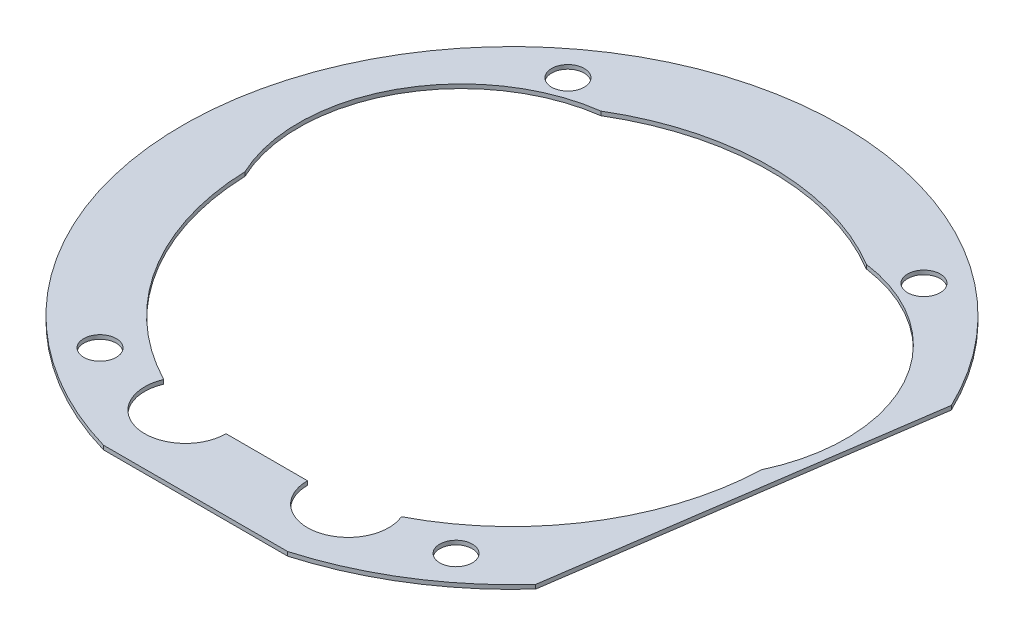
ISO-10303-21;
HEADER;
FILE_DESCRIPTION(('STEP AP214'),'2;1');
FILE_NAME('part.step','',(''),(''),'','','');
FILE_SCHEMA(('AUTOMOTIVE_DESIGN { 1 0 10303 214 1 1 1 1 }'));
ENDSEC;
DATA;
#1=APPLICATION_CONTEXT('core data for automotive mechanical design processes');
#2=APPLICATION_PROTOCOL_DEFINITION('international standard','automotive_design',2000,#1);
#3=PRODUCT_CONTEXT('',#1,'mechanical');
#4=PRODUCT('Part','Part','',(#3));
#5=PRODUCT_RELATED_PRODUCT_CATEGORY('part','',(#4));
#6=PRODUCT_DEFINITION_FORMATION('','',#4);
#7=PRODUCT_DEFINITION_CONTEXT('part definition',#1,'design');
#8=PRODUCT_DEFINITION('design','',#6,#7);
#9=PRODUCT_DEFINITION_SHAPE('','',#8);
#10=(LENGTH_UNIT() NAMED_UNIT(*) SI_UNIT(.MILLI.,.METRE.));
#11=(NAMED_UNIT(*) PLANE_ANGLE_UNIT() SI_UNIT($,.RADIAN.));
#12=(NAMED_UNIT(*) SI_UNIT($,.STERADIAN.) SOLID_ANGLE_UNIT());
#13=UNCERTAINTY_MEASURE_WITH_UNIT(LENGTH_MEASURE(1.E-05),#10,'distance_accuracy_value','');
#14=(GEOMETRIC_REPRESENTATION_CONTEXT(3) GLOBAL_UNCERTAINTY_ASSIGNED_CONTEXT((#13)) GLOBAL_UNIT_ASSIGNED_CONTEXT((#10,
#11,#12)) REPRESENTATION_CONTEXT('',''));
#15=CARTESIAN_POINT('',(0.,0.,0.));
#16=DIRECTION('',(0.,0.,1.));
#17=DIRECTION('',(1.,0.,0.));
#18=AXIS2_PLACEMENT_3D('',#15,#16,#17);
#19=CARTESIAN_POINT('',(0.,0.4,0.));
#20=DIRECTION('',(0.,1.,0.));
#21=DIRECTION('',(0.,0.,1.));
#22=AXIS2_PLACEMENT_3D('',#19,#20,#21);
#23=PLANE('',#22);
#24=CARTESIAN_POINT('',(17.5,0.4,23.));
#25=DIRECTION('',(0.,1.,0.));
#26=DIRECTION('',(0.,0.,1.));
#27=AXIS2_PLACEMENT_3D('',#24,#25,#26);
#28=CIRCLE('',#27,1.6);
#29=CARTESIAN_POINT('',(17.5,0.4,24.6));
#30=VERTEX_POINT('',#29);
#31=EDGE_CURVE('E320',#30,#30,#28,.T.);
#32=ORIENTED_EDGE('',*,*,#31,.F.);
#33=EDGE_LOOP('',(#32));
#34=FACE_BOUND('',#33,.T.);
#35=CARTESIAN_POINT('',(-17.5,0.4,-23.));
#36=DIRECTION('',(0.,1.,0.));
#37=DIRECTION('',(0.,0.,1.));
#38=AXIS2_PLACEMENT_3D('',#35,#36,#37);
#39=CIRCLE('',#38,1.6);
#40=CARTESIAN_POINT('',(-17.5,0.4,-21.4));
#41=VERTEX_POINT('',#40);
#42=EDGE_CURVE('E166',#41,#41,#39,.T.);
#43=ORIENTED_EDGE('',*,*,#42,.F.);
#44=EDGE_LOOP('',(#43));
#45=FACE_BOUND('',#44,.T.);
#46=CARTESIAN_POINT('',(0.,0.4,0.));
#47=DIRECTION('',(0.,1.,0.));
#48=DIRECTION('',(0.,0.,1.));
#49=AXIS2_PLACEMENT_3D('',#46,#47,#48);
#50=CIRCLE('',#49,32.4);
#51=CARTESIAN_POINT('',(29.2378436045863,0.4,-13.9609634822869));
#52=VERTEX_POINT('',#51);
#53=CARTESIAN_POINT('',(-9.06081428788635,0.4,31.1072603171741));
#54=VERTEX_POINT('',#53);
#55=EDGE_CURVE('E196',#52,#54,#50,.T.);
#56=ORIENTED_EDGE('',*,*,#55,.T.);
#57=DIRECTION('',(1.,0.,0.));
#58=VECTOR('',#57,1.);
#59=CARTESIAN_POINT('',(-9.06081428788635,0.4,31.1072603171741));
#60=LINE('',#59,#58);
#61=CARTESIAN_POINT('',(9.06081428788635,0.4,31.1072603171741));
#62=VERTEX_POINT('',#61);
#63=EDGE_CURVE('E199',#54,#62,#60,.T.);
#64=ORIENTED_EDGE('',*,*,#63,.T.);
#65=CARTESIAN_POINT('',(0.,0.4,0.));
#66=DIRECTION('',(0.,1.,0.));
#67=DIRECTION('',(0.,0.,1.));
#68=AXIS2_PLACEMENT_3D('',#65,#66,#67);
#69=CIRCLE('',#68,32.4);
#70=CARTESIAN_POINT('',(24.0490796532106,0.4,21.711788683421));
#71=VERTEX_POINT('',#70);
#72=EDGE_CURVE('E202',#62,#71,#69,.T.);
#73=ORIENTED_EDGE('',*,*,#72,.T.);
#74=DIRECTION('',(0.143939845714111,0.,-0.989586439284511));
#75=VECTOR('',#74,1.);
#76=CARTESIAN_POINT('',(29.2378436045863,0.4,-13.9609634822869));
#77=LINE('',#76,#75);
#78=EDGE_CURVE('E204',#71,#52,#77,.T.);
#79=ORIENTED_EDGE('',*,*,#78,.T.);
#80=EDGE_LOOP('',(#56,#64,#73,#79));
#81=FACE_BOUND('',#80,.T.);
#82=DIRECTION('',(1.,0.,0.));
#83=VECTOR('',#82,1.);
#84=CARTESIAN_POINT('',(-3.99999999999967,0.4,24.1072603171741));
#85=LINE('',#84,#83);
#86=CARTESIAN_POINT('',(-3.99999999999967,0.4,24.1072603171741));
#87=VERTEX_POINT('',#86);
#88=CARTESIAN_POINT('',(4.00000000000031,0.4,24.1072603171741));
#89=VERTEX_POINT('',#88);
#90=EDGE_CURVE('E136',#87,#89,#85,.T.);
#91=ORIENTED_EDGE('',*,*,#90,.F.);
#92=CARTESIAN_POINT('',(-7.99999999999963,0.4,24.1072603171741));
#93=DIRECTION('',(0.,1.,0.));
#94=DIRECTION('',(0.,0.,-1.));
#95=AXIS2_PLACEMENT_3D('',#92,#93,#94);
#96=CIRCLE('',#95,3.99999999999998);
#97=CARTESIAN_POINT('',(-11.6854315282744,0.4,22.5523987637238));
#98=VERTEX_POINT('',#97);
#99=EDGE_CURVE('E128',#98,#87,#96,.T.);
#100=ORIENTED_EDGE('',*,*,#99,.F.);
#101=CARTESIAN_POINT('',(0.,0.4,0.));
#102=DIRECTION('',(0.,1.,0.));
#103=DIRECTION('',(0.,0.,1.));
#104=AXIS2_PLACEMENT_3D('',#101,#102,#103);
#105=CIRCLE('',#104,25.4);
#106=CARTESIAN_POINT('',(-25.3853852768264,0.4,0.861518628404147));
#107=VERTEX_POINT('',#106);
#108=EDGE_CURVE('E163',#107,#98,#105,.T.);
#109=ORIENTED_EDGE('',*,*,#108,.F.);
#110=CARTESIAN_POINT('',(-10.9014156409906,0.4,-5.93661520289011));
#111=DIRECTION('',(0.,1.,0.));
#112=DIRECTION('',(0.,0.,-1.));
#113=AXIS2_PLACEMENT_3D('',#110,#111,#112);
#114=CIRCLE('',#113,16.);
#115=CARTESIAN_POINT('',(-13.0489842623431,0.4,-21.7918335557411));
#116=VERTEX_POINT('',#115);
#117=EDGE_CURVE('E161',#116,#107,#114,.T.);
#118=ORIENTED_EDGE('',*,*,#117,.F.);
#119=CARTESIAN_POINT('',(0.,0.4,0.));
#120=DIRECTION('',(0.,1.,0.));
#121=DIRECTION('',(0.,0.,1.));
#122=AXIS2_PLACEMENT_3D('',#119,#120,#121);
#123=CIRCLE('',#122,25.4);
#124=CARTESIAN_POINT('',(13.0489842623431,0.4,-21.7918335557411));
#125=VERTEX_POINT('',#124);
#126=EDGE_CURVE('E159',#125,#116,#123,.T.);
#127=ORIENTED_EDGE('',*,*,#126,.F.);
#128=CARTESIAN_POINT('',(10.9014156409906,0.4,-5.93661520289011));
#129=DIRECTION('',(0.,1.,0.));
#130=DIRECTION('',(0.,0.,-1.));
#131=AXIS2_PLACEMENT_3D('',#128,#129,#130);
#132=CIRCLE('',#131,16.);
#133=CARTESIAN_POINT('',(25.3853852768264,0.4,0.861518628404155));
#134=VERTEX_POINT('',#133);
#135=EDGE_CURVE('E157',#134,#125,#132,.T.);
#136=ORIENTED_EDGE('',*,*,#135,.F.);
#137=CARTESIAN_POINT('',(0.,0.4,0.));
#138=DIRECTION('',(0.,1.,0.));
#139=DIRECTION('',(0.,0.,1.));
#140=AXIS2_PLACEMENT_3D('',#137,#138,#139);
#141=CIRCLE('',#140,25.4);
#142=CARTESIAN_POINT('',(11.685431528275,0.4,22.5523987637235));
#143=VERTEX_POINT('',#142);
#144=EDGE_CURVE('E152',#143,#134,#141,.T.);
#145=ORIENTED_EDGE('',*,*,#144,.F.);
#146=CARTESIAN_POINT('',(8.00000000000034,0.4,24.1072603171741));
#147=DIRECTION('',(0.,1.,0.));
#148=DIRECTION('',(0.,0.,1.));
#149=AXIS2_PLACEMENT_3D('',#146,#147,#148);
#150=CIRCLE('',#149,4.00000000000001);
#151=EDGE_CURVE('E150',#89,#143,#150,.T.);
#152=ORIENTED_EDGE('',*,*,#151,.F.);
#153=EDGE_LOOP('',(#91,#100,#109,#118,#127,#136,#145,#152));
#154=FACE_BOUND('',#153,.T.);
#155=CARTESIAN_POINT('',(-17.5,0.4,23.));
#156=DIRECTION('',(0.,1.,0.));
#157=DIRECTION('',(0.,0.,1.));
#158=AXIS2_PLACEMENT_3D('',#155,#156,#157);
#159=CIRCLE('',#158,1.6);
#160=CARTESIAN_POINT('',(-17.5,0.4,24.6));
#161=VERTEX_POINT('',#160);
#162=EDGE_CURVE('E326',#161,#161,#159,.T.);
#163=ORIENTED_EDGE('',*,*,#162,.F.);
#164=EDGE_LOOP('',(#163));
#165=FACE_BOUND('',#164,.T.);
#166=CARTESIAN_POINT('',(17.5,0.4,-23.));
#167=DIRECTION('',(0.,1.,0.));
#168=DIRECTION('',(0.,0.,1.));
#169=AXIS2_PLACEMENT_3D('',#166,#167,#168);
#170=CIRCLE('',#169,1.6);
#171=CARTESIAN_POINT('',(17.5,0.4,-21.4));
#172=VERTEX_POINT('',#171);
#173=EDGE_CURVE('E311',#172,#172,#170,.T.);
#174=ORIENTED_EDGE('',*,*,#173,.F.);
#175=EDGE_LOOP('',(#174));
#176=FACE_BOUND('',#175,.T.);
#177=ADVANCED_FACE('F39',(#34,#45,#81,#154,#165,#176),#23,.T.);
#178=CARTESIAN_POINT('',(0.,0.,0.));
#179=DIRECTION('',(0.,1.,0.));
#180=DIRECTION('',(0.,0.,1.));
#181=AXIS2_PLACEMENT_3D('',#178,#179,#180);
#182=PLANE('',#181);
#183=CARTESIAN_POINT('',(0.,0.,0.));
#184=DIRECTION('',(0.,1.,0.));
#185=DIRECTION('',(0.,0.,1.));
#186=AXIS2_PLACEMENT_3D('',#183,#184,#185);
#187=CIRCLE('',#186,32.4);
#188=CARTESIAN_POINT('',(29.2378436045863,0.,-13.9609634822869));
#189=VERTEX_POINT('',#188);
#190=CARTESIAN_POINT('',(-9.06081428788635,0.,31.1072603171741));
#191=VERTEX_POINT('',#190);
#192=EDGE_CURVE('E144',#189,#191,#187,.T.);
#193=ORIENTED_EDGE('',*,*,#192,.F.);
#194=DIRECTION('',(0.143939845714111,0.,-0.989586439284511));
#195=VECTOR('',#194,1.);
#196=CARTESIAN_POINT('',(29.2378436045863,0.,-13.9609634822869));
#197=LINE('',#196,#195);
#198=CARTESIAN_POINT('',(24.0490796532106,0.,21.711788683421));
#199=VERTEX_POINT('',#198);
#200=EDGE_CURVE('E200',#199,#189,#197,.T.);
#201=ORIENTED_EDGE('',*,*,#200,.F.);
#202=CARTESIAN_POINT('',(0.,0.,0.));
#203=DIRECTION('',(0.,1.,0.));
#204=DIRECTION('',(0.,0.,1.));
#205=AXIS2_PLACEMENT_3D('',#202,#203,#204);
#206=CIRCLE('',#205,32.4);
#207=CARTESIAN_POINT('',(9.06081428788635,0.,31.1072603171741));
#208=VERTEX_POINT('',#207);
#209=EDGE_CURVE('E211',#208,#199,#206,.T.);
#210=ORIENTED_EDGE('',*,*,#209,.F.);
#211=DIRECTION('',(1.,0.,0.));
#212=VECTOR('',#211,1.);
#213=CARTESIAN_POINT('',(-9.06081428788635,0.,31.1072603171741));
#214=LINE('',#213,#212);
#215=EDGE_CURVE('E209',#191,#208,#214,.T.);
#216=ORIENTED_EDGE('',*,*,#215,.F.);
#217=EDGE_LOOP('',(#193,#201,#210,#216));
#218=FACE_BOUND('',#217,.T.);
#219=CARTESIAN_POINT('',(-7.99999999999963,0.,24.1072603171741));
#220=DIRECTION('',(0.,1.,0.));
#221=DIRECTION('',(0.,0.,-1.));
#222=AXIS2_PLACEMENT_3D('',#219,#220,#221);
#223=CIRCLE('',#222,3.99999999999998);
#224=CARTESIAN_POINT('',(-11.6854315282744,0.,22.5523987637238));
#225=VERTEX_POINT('',#224);
#226=CARTESIAN_POINT('',(-3.99999999999967,0.,24.1072603171741));
#227=VERTEX_POINT('',#226);
#228=EDGE_CURVE('E62',#225,#227,#223,.T.);
#229=ORIENTED_EDGE('',*,*,#228,.T.);
#230=DIRECTION('',(1.,0.,0.));
#231=VECTOR('',#230,1.);
#232=CARTESIAN_POINT('',(-3.99999999999967,0.,24.1072603171741));
#233=LINE('',#232,#231);
#234=CARTESIAN_POINT('',(4.00000000000031,0.,24.1072603171741));
#235=VERTEX_POINT('',#234);
#236=EDGE_CURVE('E143',#227,#235,#233,.T.);
#237=ORIENTED_EDGE('',*,*,#236,.T.);
#238=CARTESIAN_POINT('',(8.00000000000034,0.,24.1072603171741));
#239=DIRECTION('',(0.,1.,0.));
#240=DIRECTION('',(0.,0.,1.));
#241=AXIS2_PLACEMENT_3D('',#238,#239,#240);
#242=CIRCLE('',#241,4.00000000000001);
#243=CARTESIAN_POINT('',(11.685431528275,0.,22.5523987637235));
#244=VERTEX_POINT('',#243);
#245=EDGE_CURVE('E168',#235,#244,#242,.T.);
#246=ORIENTED_EDGE('',*,*,#245,.T.);
#247=CARTESIAN_POINT('',(0.,0.,0.));
#248=DIRECTION('',(0.,1.,0.));
#249=DIRECTION('',(0.,0.,1.));
#250=AXIS2_PLACEMENT_3D('',#247,#248,#249);
#251=CIRCLE('',#250,25.4);
#252=CARTESIAN_POINT('',(25.3853852768264,0.,0.861518628404155));
#253=VERTEX_POINT('',#252);
#254=EDGE_CURVE('E171',#244,#253,#251,.T.);
#255=ORIENTED_EDGE('',*,*,#254,.T.);
#256=CARTESIAN_POINT('',(10.9014156409906,0.,-5.93661520289011));
#257=DIRECTION('',(0.,1.,0.));
#258=DIRECTION('',(0.,0.,-1.));
#259=AXIS2_PLACEMENT_3D('',#256,#257,#258);
#260=CIRCLE('',#259,16.);
#261=CARTESIAN_POINT('',(13.0489842623431,0.,-21.7918335557411));
#262=VERTEX_POINT('',#261);
#263=EDGE_CURVE('E174',#253,#262,#260,.T.);
#264=ORIENTED_EDGE('',*,*,#263,.T.);
#265=CARTESIAN_POINT('',(0.,0.,0.));
#266=DIRECTION('',(0.,1.,0.));
#267=DIRECTION('',(0.,0.,1.));
#268=AXIS2_PLACEMENT_3D('',#265,#266,#267);
#269=CIRCLE('',#268,25.4);
#270=CARTESIAN_POINT('',(-13.0489842623431,0.,-21.7918335557411));
#271=VERTEX_POINT('',#270);
#272=EDGE_CURVE('E177',#262,#271,#269,.T.);
#273=ORIENTED_EDGE('',*,*,#272,.T.);
#274=CARTESIAN_POINT('',(-10.9014156409906,0.,-5.93661520289011));
#275=DIRECTION('',(0.,1.,0.));
#276=DIRECTION('',(0.,0.,-1.));
#277=AXIS2_PLACEMENT_3D('',#274,#275,#276);
#278=CIRCLE('',#277,16.);
#279=CARTESIAN_POINT('',(-25.3853852768264,0.,0.861518628404147));
#280=VERTEX_POINT('',#279);
#281=EDGE_CURVE('E180',#271,#280,#278,.T.);
#282=ORIENTED_EDGE('',*,*,#281,.T.);
#283=CARTESIAN_POINT('',(0.,0.,0.));
#284=DIRECTION('',(0.,1.,0.));
#285=DIRECTION('',(0.,0.,1.));
#286=AXIS2_PLACEMENT_3D('',#283,#284,#285);
#287=CIRCLE('',#286,25.4);
#288=EDGE_CURVE('E137',#280,#225,#287,.T.);
#289=ORIENTED_EDGE('',*,*,#288,.T.);
#290=EDGE_LOOP('',(#229,#237,#246,#255,#264,#273,#282,#289));
#291=FACE_BOUND('',#290,.T.);
#292=CARTESIAN_POINT('',(-17.5,0.,-23.));
#293=DIRECTION('',(0.,1.,0.));
#294=DIRECTION('',(0.,0.,1.));
#295=AXIS2_PLACEMENT_3D('',#292,#293,#294);
#296=CIRCLE('',#295,1.6);
#297=CARTESIAN_POINT('',(-17.5,0.,-21.4));
#298=VERTEX_POINT('',#297);
#299=EDGE_CURVE('E329',#298,#298,#296,.T.);
#300=ORIENTED_EDGE('',*,*,#299,.T.);
#301=EDGE_LOOP('',(#300));
#302=FACE_BOUND('',#301,.T.);
#303=CARTESIAN_POINT('',(-17.5,0.,23.));
#304=DIRECTION('',(0.,1.,0.));
#305=DIRECTION('',(0.,0.,1.));
#306=AXIS2_PLACEMENT_3D('',#303,#304,#305);
#307=CIRCLE('',#306,1.6);
#308=CARTESIAN_POINT('',(-17.5,0.,24.6));
#309=VERTEX_POINT('',#308);
#310=EDGE_CURVE('E323',#309,#309,#307,.T.);
#311=ORIENTED_EDGE('',*,*,#310,.T.);
#312=EDGE_LOOP('',(#311));
#313=FACE_BOUND('',#312,.T.);
#314=CARTESIAN_POINT('',(17.5,0.,23.));
#315=DIRECTION('',(0.,1.,0.));
#316=DIRECTION('',(0.,0.,1.));
#317=AXIS2_PLACEMENT_3D('',#314,#315,#316);
#318=CIRCLE('',#317,1.6);
#319=CARTESIAN_POINT('',(17.5,0.,24.6));
#320=VERTEX_POINT('',#319);
#321=EDGE_CURVE('E317',#320,#320,#318,.T.);
#322=ORIENTED_EDGE('',*,*,#321,.T.);
#323=EDGE_LOOP('',(#322));
#324=FACE_BOUND('',#323,.T.);
#325=CARTESIAN_POINT('',(17.5,0.,-23.));
#326=DIRECTION('',(0.,1.,0.));
#327=DIRECTION('',(0.,0.,1.));
#328=AXIS2_PLACEMENT_3D('',#325,#326,#327);
#329=CIRCLE('',#328,1.6);
#330=CARTESIAN_POINT('',(17.5,0.,-21.4));
#331=VERTEX_POINT('',#330);
#332=EDGE_CURVE('E314',#331,#331,#329,.T.);
#333=ORIENTED_EDGE('',*,*,#332,.T.);
#334=EDGE_LOOP('',(#333));
#335=FACE_BOUND('',#334,.T.);
#336=ADVANCED_FACE('F229',(#218,#291,#302,#313,#324,#335),#182,.F.);
#337=CARTESIAN_POINT('',(0.,0.4,0.));
#338=DIRECTION('',(0.,-1.,0.));
#339=DIRECTION('',(0.,0.,-1.));
#340=AXIS2_PLACEMENT_3D('',#337,#338,#339);
#341=CYLINDRICAL_SURFACE('',#340,32.4);
#342=ORIENTED_EDGE('',*,*,#192,.T.);
#343=DIRECTION('',(0.,-1.,0.));
#344=VECTOR('',#343,1.);
#345=CARTESIAN_POINT('',(-9.06081428788635,0.4,31.1072603171741));
#346=LINE('',#345,#344);
#347=EDGE_CURVE('E11',#54,#191,#346,.T.);
#348=ORIENTED_EDGE('',*,*,#347,.F.);
#349=ORIENTED_EDGE('',*,*,#55,.F.);
#350=DIRECTION('',(0.,-1.,0.));
#351=VECTOR('',#350,1.);
#352=CARTESIAN_POINT('',(29.2378436045863,0.4,-13.9609634822869));
#353=LINE('',#352,#351);
#354=EDGE_CURVE('E206',#52,#189,#353,.T.);
#355=ORIENTED_EDGE('',*,*,#354,.T.);
#356=EDGE_LOOP('',(#342,#348,#349,#355));
#357=FACE_BOUND('',#356,.T.);
#358=ADVANCED_FACE('F41',(#357),#341,.T.);
#359=CARTESIAN_POINT('',(-9.06081428788635,0.4,31.1072603171741));
#360=DIRECTION('',(0.,0.,-1.));
#361=DIRECTION('',(-1.,0.,0.));
#362=AXIS2_PLACEMENT_3D('',#359,#360,#361);
#363=PLANE('',#362);
#364=ORIENTED_EDGE('',*,*,#215,.T.);
#365=DIRECTION('',(0.,-1.,0.));
#366=VECTOR('',#365,1.);
#367=CARTESIAN_POINT('',(9.06081428788635,0.4,31.1072603171741));
#368=LINE('',#367,#366);
#369=EDGE_CURVE('E47',#62,#208,#368,.T.);
#370=ORIENTED_EDGE('',*,*,#369,.F.);
#371=ORIENTED_EDGE('',*,*,#63,.F.);
#372=ORIENTED_EDGE('',*,*,#347,.T.);
#373=EDGE_LOOP('',(#364,#370,#371,#372));
#374=FACE_BOUND('',#373,.T.);
#375=ADVANCED_FACE('F239',(#374),#363,.F.);
#376=CARTESIAN_POINT('',(0.,0.4,0.));
#377=DIRECTION('',(0.,-1.,0.));
#378=DIRECTION('',(0.,0.,-1.));
#379=AXIS2_PLACEMENT_3D('',#376,#377,#378);
#380=CYLINDRICAL_SURFACE('',#379,32.4);
#381=ORIENTED_EDGE('',*,*,#209,.T.);
#382=DIRECTION('',(0.,-1.,0.));
#383=VECTOR('',#382,1.);
#384=CARTESIAN_POINT('',(24.0490796532106,0.4,21.711788683421));
#385=LINE('',#384,#383);
#386=EDGE_CURVE('E216',#71,#199,#385,.T.);
#387=ORIENTED_EDGE('',*,*,#386,.F.);
#388=ORIENTED_EDGE('',*,*,#72,.F.);
#389=ORIENTED_EDGE('',*,*,#369,.T.);
#390=EDGE_LOOP('',(#381,#387,#388,#389));
#391=FACE_BOUND('',#390,.T.);
#392=ADVANCED_FACE('F223',(#391),#380,.T.);
#393=CARTESIAN_POINT('',(29.2378436045863,0.4,-13.9609634822869));
#394=DIRECTION('',(-0.989586439284511,0.,-0.143939845714111));
#395=DIRECTION('',(-0.143939845714111,0.,0.989586439284511));
#396=AXIS2_PLACEMENT_3D('',#393,#394,#395);
#397=PLANE('',#396);
#398=ORIENTED_EDGE('',*,*,#200,.T.);
#399=ORIENTED_EDGE('',*,*,#354,.F.);
#400=ORIENTED_EDGE('',*,*,#78,.F.);
#401=ORIENTED_EDGE('',*,*,#386,.T.);
#402=EDGE_LOOP('',(#398,#399,#400,#401));
#403=FACE_BOUND('',#402,.T.);
#404=ADVANCED_FACE('F233',(#403),#397,.F.);
#405=CARTESIAN_POINT('',(-7.99999999999963,0.4,24.1072603171741));
#406=DIRECTION('',(0.,-1.,0.));
#407=DIRECTION('',(0.,0.,-1.));
#408=AXIS2_PLACEMENT_3D('',#405,#406,#407);
#409=CYLINDRICAL_SURFACE('',#408,3.99999999999998);
#410=ORIENTED_EDGE('',*,*,#228,.F.);
#411=DIRECTION('',(0.,-1.,0.));
#412=VECTOR('',#411,1.);
#413=CARTESIAN_POINT('',(-11.6854315282744,0.4,22.5523987637238));
#414=LINE('',#413,#412);
#415=EDGE_CURVE('E132',#98,#225,#414,.T.);
#416=ORIENTED_EDGE('',*,*,#415,.F.);
#417=ORIENTED_EDGE('',*,*,#99,.T.);
#418=DIRECTION('',(0.,-1.,0.));
#419=VECTOR('',#418,1.);
#420=CARTESIAN_POINT('',(-3.99999999999967,0.4,24.1072603171741));
#421=LINE('',#420,#419);
#422=EDGE_CURVE('E131',#87,#227,#421,.T.);
#423=ORIENTED_EDGE('',*,*,#422,.T.);
#424=EDGE_LOOP('',(#410,#416,#417,#423));
#425=FACE_BOUND('',#424,.T.);
#426=ADVANCED_FACE('F130',(#425),#409,.F.);
#427=CARTESIAN_POINT('',(-3.99999999999967,0.4,24.1072603171741));
#428=DIRECTION('',(0.,0.,-1.));
#429=DIRECTION('',(-1.,0.,0.));
#430=AXIS2_PLACEMENT_3D('',#427,#428,#429);
#431=PLANE('',#430);
#432=ORIENTED_EDGE('',*,*,#236,.F.);
#433=ORIENTED_EDGE('',*,*,#422,.F.);
#434=ORIENTED_EDGE('',*,*,#90,.T.);
#435=DIRECTION('',(0.,-1.,0.));
#436=VECTOR('',#435,1.);
#437=CARTESIAN_POINT('',(4.00000000000031,0.4,24.1072603171741));
#438=LINE('',#437,#436);
#439=EDGE_CURVE('E145',#89,#235,#438,.T.);
#440=ORIENTED_EDGE('',*,*,#439,.T.);
#441=EDGE_LOOP('',(#432,#433,#434,#440));
#442=FACE_BOUND('',#441,.T.);
#443=ADVANCED_FACE('F140',(#442),#431,.T.);
#444=CARTESIAN_POINT('',(8.00000000000034,0.4,24.1072603171741));
#445=DIRECTION('',(0.,-1.,0.));
#446=DIRECTION('',(0.,0.,-1.));
#447=AXIS2_PLACEMENT_3D('',#444,#445,#446);
#448=CYLINDRICAL_SURFACE('',#447,4.00000000000001);
#449=ORIENTED_EDGE('',*,*,#245,.F.);
#450=ORIENTED_EDGE('',*,*,#439,.F.);
#451=ORIENTED_EDGE('',*,*,#151,.T.);
#452=DIRECTION('',(0.,-1.,0.));
#453=VECTOR('',#452,1.);
#454=CARTESIAN_POINT('',(11.685431528275,0.4,22.5523987637235));
#455=LINE('',#454,#453);
#456=EDGE_CURVE('E193',#143,#244,#455,.T.);
#457=ORIENTED_EDGE('',*,*,#456,.T.);
#458=EDGE_LOOP('',(#449,#450,#451,#457));
#459=FACE_BOUND('',#458,.T.);
#460=ADVANCED_FACE('F265',(#459),#448,.F.);
#461=CARTESIAN_POINT('',(0.,0.4,0.));
#462=DIRECTION('',(0.,-1.,0.));
#463=DIRECTION('',(0.,0.,-1.));
#464=AXIS2_PLACEMENT_3D('',#461,#462,#463);
#465=CYLINDRICAL_SURFACE('',#464,25.4);
#466=ORIENTED_EDGE('',*,*,#254,.F.);
#467=ORIENTED_EDGE('',*,*,#456,.F.);
#468=ORIENTED_EDGE('',*,*,#144,.T.);
#469=DIRECTION('',(0.,-1.,0.));
#470=VECTOR('',#469,1.);
#471=CARTESIAN_POINT('',(25.3853852768264,0.4,0.861518628404155));
#472=LINE('',#471,#470);
#473=EDGE_CURVE('E191',#134,#253,#472,.T.);
#474=ORIENTED_EDGE('',*,*,#473,.T.);
#475=EDGE_LOOP('',(#466,#467,#468,#474));
#476=FACE_BOUND('',#475,.T.);
#477=ADVANCED_FACE('F269',(#476),#465,.F.);
#478=CARTESIAN_POINT('',(10.9014156409906,0.4,-5.93661520289011));
#479=DIRECTION('',(0.,-1.,0.));
#480=DIRECTION('',(0.,0.,-1.));
#481=AXIS2_PLACEMENT_3D('',#478,#479,#480);
#482=CYLINDRICAL_SURFACE('',#481,16.);
#483=ORIENTED_EDGE('',*,*,#263,.F.);
#484=ORIENTED_EDGE('',*,*,#473,.F.);
#485=ORIENTED_EDGE('',*,*,#135,.T.);
#486=DIRECTION('',(0.,-1.,0.));
#487=VECTOR('',#486,1.);
#488=CARTESIAN_POINT('',(13.0489842623431,0.4,-21.7918335557411));
#489=LINE('',#488,#487);
#490=EDGE_CURVE('E189',#125,#262,#489,.T.);
#491=ORIENTED_EDGE('',*,*,#490,.T.);
#492=EDGE_LOOP('',(#483,#484,#485,#491));
#493=FACE_BOUND('',#492,.T.);
#494=ADVANCED_FACE('F275',(#493),#482,.F.);
#495=CARTESIAN_POINT('',(0.,0.4,0.));
#496=DIRECTION('',(0.,-1.,0.));
#497=DIRECTION('',(0.,0.,-1.));
#498=AXIS2_PLACEMENT_3D('',#495,#496,#497);
#499=CYLINDRICAL_SURFACE('',#498,25.4);
#500=ORIENTED_EDGE('',*,*,#272,.F.);
#501=ORIENTED_EDGE('',*,*,#490,.F.);
#502=ORIENTED_EDGE('',*,*,#126,.T.);
#503=DIRECTION('',(0.,-1.,0.));
#504=VECTOR('',#503,1.);
#505=CARTESIAN_POINT('',(-13.0489842623431,0.4,-21.7918335557411));
#506=LINE('',#505,#504);
#507=EDGE_CURVE('E187',#116,#271,#506,.T.);
#508=ORIENTED_EDGE('',*,*,#507,.T.);
#509=EDGE_LOOP('',(#500,#501,#502,#508));
#510=FACE_BOUND('',#509,.T.);
#511=ADVANCED_FACE('F279',(#510),#499,.F.);
#512=CARTESIAN_POINT('',(-10.9014156409906,0.4,-5.93661520289011));
#513=DIRECTION('',(0.,-1.,0.));
#514=DIRECTION('',(0.,0.,-1.));
#515=AXIS2_PLACEMENT_3D('',#512,#513,#514);
#516=CYLINDRICAL_SURFACE('',#515,16.);
#517=ORIENTED_EDGE('',*,*,#281,.F.);
#518=ORIENTED_EDGE('',*,*,#507,.F.);
#519=ORIENTED_EDGE('',*,*,#117,.T.);
#520=DIRECTION('',(0.,-1.,0.));
#521=VECTOR('',#520,1.);
#522=CARTESIAN_POINT('',(-25.3853852768264,0.4,0.861518628404147));
#523=LINE('',#522,#521);
#524=EDGE_CURVE('E54',#107,#280,#523,.T.);
#525=ORIENTED_EDGE('',*,*,#524,.T.);
#526=EDGE_LOOP('',(#517,#518,#519,#525));
#527=FACE_BOUND('',#526,.T.);
#528=ADVANCED_FACE('F283',(#527),#516,.F.);
#529=CARTESIAN_POINT('',(0.,0.4,0.));
#530=DIRECTION('',(0.,-1.,0.));
#531=DIRECTION('',(0.,0.,-1.));
#532=AXIS2_PLACEMENT_3D('',#529,#530,#531);
#533=CYLINDRICAL_SURFACE('',#532,25.4);
#534=ORIENTED_EDGE('',*,*,#288,.F.);
#535=ORIENTED_EDGE('',*,*,#524,.F.);
#536=ORIENTED_EDGE('',*,*,#108,.T.);
#537=ORIENTED_EDGE('',*,*,#415,.T.);
#538=EDGE_LOOP('',(#534,#535,#536,#537));
#539=FACE_BOUND('',#538,.T.);
#540=ADVANCED_FACE('F287',(#539),#533,.F.);
#541=CARTESIAN_POINT('',(-17.5,0.4,-23.));
#542=DIRECTION('',(0.,-1.,0.));
#543=DIRECTION('',(0.,0.,-1.));
#544=AXIS2_PLACEMENT_3D('',#541,#542,#543);
#545=CYLINDRICAL_SURFACE('',#544,1.6);
#546=ORIENTED_EDGE('',*,*,#42,.T.);
#547=EDGE_LOOP('',(#546));
#548=FACE_BOUND('',#547,.T.);
#549=ORIENTED_EDGE('',*,*,#299,.F.);
#550=EDGE_LOOP('',(#549));
#551=FACE_BOUND('',#550,.T.);
#552=ADVANCED_FACE('F291',(#548,#551),#545,.F.);
#553=CARTESIAN_POINT('',(-17.5,0.4,23.));
#554=DIRECTION('',(0.,-1.,0.));
#555=DIRECTION('',(0.,0.,-1.));
#556=AXIS2_PLACEMENT_3D('',#553,#554,#555);
#557=CYLINDRICAL_SURFACE('',#556,1.6);
#558=ORIENTED_EDGE('',*,*,#162,.T.);
#559=EDGE_LOOP('',(#558));
#560=FACE_BOUND('',#559,.T.);
#561=ORIENTED_EDGE('',*,*,#310,.F.);
#562=EDGE_LOOP('',(#561));
#563=FACE_BOUND('',#562,.T.);
#564=ADVANCED_FACE('F294',(#560,#563),#557,.F.);
#565=CARTESIAN_POINT('',(17.5,0.4,23.));
#566=DIRECTION('',(0.,-1.,0.));
#567=DIRECTION('',(0.,0.,-1.));
#568=AXIS2_PLACEMENT_3D('',#565,#566,#567);
#569=CYLINDRICAL_SURFACE('',#568,1.6);
#570=ORIENTED_EDGE('',*,*,#31,.T.);
#571=EDGE_LOOP('',(#570));
#572=FACE_BOUND('',#571,.T.);
#573=ORIENTED_EDGE('',*,*,#321,.F.);
#574=EDGE_LOOP('',(#573));
#575=FACE_BOUND('',#574,.T.);
#576=ADVANCED_FACE('F298',(#572,#575),#569,.F.);
#577=CARTESIAN_POINT('',(17.5,0.4,-23.));
#578=DIRECTION('',(0.,-1.,0.));
#579=DIRECTION('',(0.,0.,-1.));
#580=AXIS2_PLACEMENT_3D('',#577,#578,#579);
#581=CYLINDRICAL_SURFACE('',#580,1.6);
#582=ORIENTED_EDGE('',*,*,#173,.T.);
#583=EDGE_LOOP('',(#582));
#584=FACE_BOUND('',#583,.T.);
#585=ORIENTED_EDGE('',*,*,#332,.F.);
#586=EDGE_LOOP('',(#585));
#587=FACE_BOUND('',#586,.T.);
#588=ADVANCED_FACE('F302',(#584,#587),#581,.F.);
#589=CLOSED_SHELL('',(#177,#336,#358,#375,#392,#404,#426,#443,#460,#477,#494,#511,#528,#540,
#552,#564,#576,#588));
#590=MANIFOLD_SOLID_BREP('B2',#589);
#591=ADVANCED_BREP_SHAPE_REPRESENTATION('',(#18,#590),#14);
#592=SHAPE_DEFINITION_REPRESENTATION(#9,#591);
ENDSEC;
END-ISO-10303-21;
